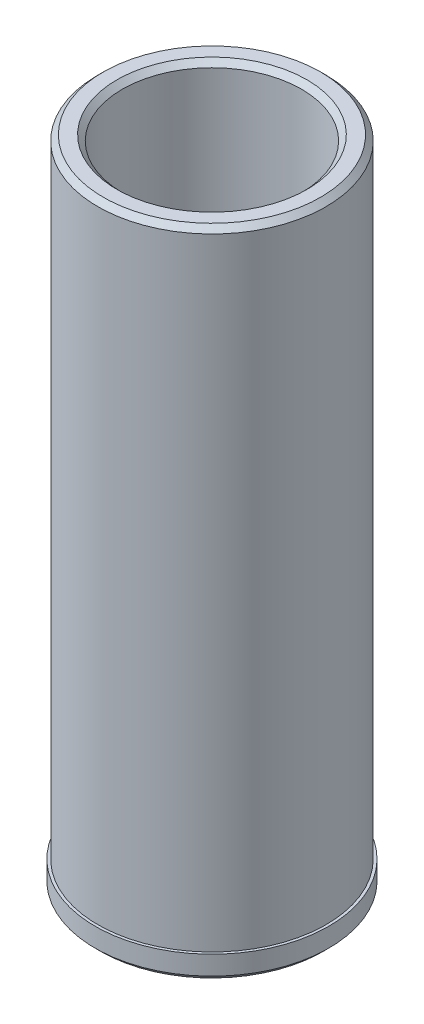
ISO-10303-21;
HEADER;
FILE_DESCRIPTION(('STEP AP214'),'2;1');
FILE_NAME('part.step','',(''),(''),'','','');
FILE_SCHEMA(('AUTOMOTIVE_DESIGN { 1 0 10303 214 1 1 1 1 }'));
ENDSEC;
DATA;
#1=APPLICATION_CONTEXT('core data for automotive mechanical design processes');
#2=APPLICATION_PROTOCOL_DEFINITION('international standard','automotive_design',2000,#1);
#3=PRODUCT_CONTEXT('',#1,'mechanical');
#4=PRODUCT('Part','Part','',(#3));
#5=PRODUCT_RELATED_PRODUCT_CATEGORY('part','',(#4));
#6=PRODUCT_DEFINITION_FORMATION('','',#4);
#7=PRODUCT_DEFINITION_CONTEXT('part definition',#1,'design');
#8=PRODUCT_DEFINITION('design','',#6,#7);
#9=PRODUCT_DEFINITION_SHAPE('','',#8);
#10=(LENGTH_UNIT() NAMED_UNIT(*) SI_UNIT(.MILLI.,.METRE.));
#11=(NAMED_UNIT(*) PLANE_ANGLE_UNIT() SI_UNIT($,.RADIAN.));
#12=(NAMED_UNIT(*) SI_UNIT($,.STERADIAN.) SOLID_ANGLE_UNIT());
#13=UNCERTAINTY_MEASURE_WITH_UNIT(LENGTH_MEASURE(1.E-05),#10,'distance_accuracy_value','');
#14=(GEOMETRIC_REPRESENTATION_CONTEXT(3) GLOBAL_UNCERTAINTY_ASSIGNED_CONTEXT((#13)) GLOBAL_UNIT_ASSIGNED_CONTEXT((#10,
#11,#12)) REPRESENTATION_CONTEXT('',''));
#15=CARTESIAN_POINT('',(0.,0.,0.));
#16=DIRECTION('',(0.,0.,1.));
#17=DIRECTION('',(1.,0.,0.));
#18=AXIS2_PLACEMENT_3D('',#15,#16,#17);
#19=CARTESIAN_POINT('',(0.,0.,0.));
#20=DIRECTION('',(0.,-1.,0.));
#21=DIRECTION('',(0.,0.,-1.));
#22=AXIS2_PLACEMENT_3D('',#19,#20,#21);
#23=PLANE('',#22);
#24=CARTESIAN_POINT('',(0.,0.,0.));
#25=DIRECTION('',(0.,-1.,0.));
#26=DIRECTION('',(0.,0.,-1.));
#27=AXIS2_PLACEMENT_3D('',#24,#25,#26);
#28=CIRCLE('',#27,6.99999999999999);
#29=CARTESIAN_POINT('',(0.,0.,-6.99999999999999));
#30=VERTEX_POINT('',#29);
#31=EDGE_CURVE('E72',#30,#30,#28,.T.);
#32=ORIENTED_EDGE('',*,*,#31,.F.);
#33=EDGE_LOOP('',(#32));
#34=FACE_BOUND('',#33,.T.);
#35=CARTESIAN_POINT('',(0.,0.,0.));
#36=DIRECTION('',(0.,-1.,0.));
#37=DIRECTION('',(0.,0.,-1.));
#38=AXIS2_PLACEMENT_3D('',#35,#36,#37);
#39=CIRCLE('',#38,20.5);
#40=CARTESIAN_POINT('',(0.,0.,-20.5));
#41=VERTEX_POINT('',#40);
#42=EDGE_CURVE('E66',#41,#41,#39,.T.);
#43=ORIENTED_EDGE('',*,*,#42,.T.);
#44=EDGE_LOOP('',(#43));
#45=FACE_BOUND('',#44,.T.);
#46=ADVANCED_FACE('F35',(#34,#45),#23,.T.);
#47=CARTESIAN_POINT('',(0.,13.,0.));
#48=DIRECTION('',(0.,1.,0.));
#49=DIRECTION('',(0.,0.,1.));
#50=AXIS2_PLACEMENT_3D('',#47,#48,#49);
#51=CONICAL_SURFACE('',#50,16.5,1.39626340159546);
#52=CARTESIAN_POINT('',(0.,11.3248936832695,0.));
#53=DIRECTION('',(0.,1.,0.));
#54=DIRECTION('',(0.,0.,1.));
#55=AXIS2_PLACEMENT_3D('',#52,#53,#54);
#56=CIRCLE('',#55,6.99999999999999);
#57=CARTESIAN_POINT('',(0.,11.3248936832695,6.99999999999999));
#58=VERTEX_POINT('',#57);
#59=EDGE_CURVE('E69',#58,#58,#56,.T.);
#60=ORIENTED_EDGE('',*,*,#59,.F.);
#61=EDGE_LOOP('',(#60));
#62=FACE_BOUND('',#61,.T.);
#63=CARTESIAN_POINT('',(0.,13.,0.));
#64=DIRECTION('',(0.,-1.,0.));
#65=DIRECTION('',(0.,0.,-1.));
#66=AXIS2_PLACEMENT_3D('',#63,#64,#65);
#67=CIRCLE('',#66,16.5);
#68=CARTESIAN_POINT('',(0.,13.,-16.5));
#69=VERTEX_POINT('',#68);
#70=EDGE_CURVE('E10',#69,#69,#67,.T.);
#71=ORIENTED_EDGE('',*,*,#70,.F.);
#72=EDGE_LOOP('',(#71));
#73=FACE_BOUND('',#72,.T.);
#74=ADVANCED_FACE('F80',(#62,#73),#51,.F.);
#75=CARTESIAN_POINT('',(0.,0.,0.));
#76=DIRECTION('',(0.,-1.,0.));
#77=DIRECTION('',(0.,0.,-1.));
#78=AXIS2_PLACEMENT_3D('',#75,#76,#77);
#79=CYLINDRICAL_SURFACE('',#78,16.5);
#80=ORIENTED_EDGE('',*,*,#70,.T.);
#81=EDGE_LOOP('',(#80));
#82=FACE_BOUND('',#81,.T.);
#83=CARTESIAN_POINT('',(0.,119.,0.));
#84=DIRECTION('',(0.,-1.,0.));
#85=DIRECTION('',(0.,0.,-1.));
#86=AXIS2_PLACEMENT_3D('',#83,#84,#85);
#87=CIRCLE('',#86,16.5);
#88=CARTESIAN_POINT('',(0.,119.,-16.5));
#89=VERTEX_POINT('',#88);
#90=EDGE_CURVE('E41',#89,#89,#87,.T.);
#91=ORIENTED_EDGE('',*,*,#90,.F.);
#92=EDGE_LOOP('',(#91));
#93=FACE_BOUND('',#92,.T.);
#94=ADVANCED_FACE('F116',(#82,#93),#79,.F.);
#95=CARTESIAN_POINT('',(0.,120.,0.));
#96=DIRECTION('',(0.,1.,0.));
#97=DIRECTION('',(0.,0.,1.));
#98=AXIS2_PLACEMENT_3D('',#95,#96,#97);
#99=CONICAL_SURFACE('',#98,17.5,0.785398163397448);
#100=ORIENTED_EDGE('',*,*,#90,.T.);
#101=EDGE_LOOP('',(#100));
#102=FACE_BOUND('',#101,.T.);
#103=CARTESIAN_POINT('',(0.,120.,0.));
#104=DIRECTION('',(0.,-1.,0.));
#105=DIRECTION('',(0.,0.,-1.));
#106=AXIS2_PLACEMENT_3D('',#103,#104,#105);
#107=CIRCLE('',#106,17.5);
#108=CARTESIAN_POINT('',(0.,120.,-17.5));
#109=VERTEX_POINT('',#108);
#110=EDGE_CURVE('E45',#109,#109,#107,.T.);
#111=ORIENTED_EDGE('',*,*,#110,.F.);
#112=EDGE_LOOP('',(#111));
#113=FACE_BOUND('',#112,.T.);
#114=ADVANCED_FACE('F112',(#102,#113),#99,.F.);
#115=CARTESIAN_POINT('',(0.,120.,0.));
#116=DIRECTION('',(0.,1.,0.));
#117=DIRECTION('',(0.,0.,1.));
#118=AXIS2_PLACEMENT_3D('',#115,#116,#117);
#119=PLANE('',#118);
#120=ORIENTED_EDGE('',*,*,#110,.T.);
#121=EDGE_LOOP('',(#120));
#122=FACE_BOUND('',#121,.T.);
#123=CARTESIAN_POINT('',(0.,120.,0.));
#124=DIRECTION('',(0.,-1.,0.));
#125=DIRECTION('',(0.,0.,-1.));
#126=AXIS2_PLACEMENT_3D('',#123,#124,#125);
#127=CIRCLE('',#126,20.);
#128=CARTESIAN_POINT('',(0.,120.,-20.));
#129=VERTEX_POINT('',#128);
#130=EDGE_CURVE('E49',#129,#129,#127,.T.);
#131=ORIENTED_EDGE('',*,*,#130,.F.);
#132=EDGE_LOOP('',(#131));
#133=FACE_BOUND('',#132,.T.);
#134=ADVANCED_FACE('F108',(#122,#133),#119,.T.);
#135=CARTESIAN_POINT('',(0.,119.,0.));
#136=DIRECTION('',(0.,-1.,0.));
#137=DIRECTION('',(0.,0.,-1.));
#138=AXIS2_PLACEMENT_3D('',#135,#136,#137);
#139=CONICAL_SURFACE('',#138,21.,0.785398163397448);
#140=ORIENTED_EDGE('',*,*,#130,.T.);
#141=EDGE_LOOP('',(#140));
#142=FACE_BOUND('',#141,.T.);
#143=CARTESIAN_POINT('',(0.,119.,0.));
#144=DIRECTION('',(0.,-1.,0.));
#145=DIRECTION('',(0.,0.,-1.));
#146=AXIS2_PLACEMENT_3D('',#143,#144,#145);
#147=CIRCLE('',#146,21.);
#148=CARTESIAN_POINT('',(0.,119.,-21.));
#149=VERTEX_POINT('',#148);
#150=EDGE_CURVE('E54',#149,#149,#147,.T.);
#151=ORIENTED_EDGE('',*,*,#150,.F.);
#152=EDGE_LOOP('',(#151));
#153=FACE_BOUND('',#152,.T.);
#154=ADVANCED_FACE('F104',(#142,#153),#139,.T.);
#155=CARTESIAN_POINT('',(0.,0.,0.));
#156=DIRECTION('',(0.,-1.,0.));
#157=DIRECTION('',(0.,0.,-1.));
#158=AXIS2_PLACEMENT_3D('',#155,#156,#157);
#159=CYLINDRICAL_SURFACE('',#158,21.);
#160=ORIENTED_EDGE('',*,*,#150,.T.);
#161=EDGE_LOOP('',(#160));
#162=FACE_BOUND('',#161,.T.);
#163=CARTESIAN_POINT('',(0.,4.5,0.));
#164=DIRECTION('',(0.,-1.,0.));
#165=DIRECTION('',(0.,0.,-1.));
#166=AXIS2_PLACEMENT_3D('',#163,#164,#165);
#167=CIRCLE('',#166,21.);
#168=CARTESIAN_POINT('',(0.,4.5,-21.));
#169=VERTEX_POINT('',#168);
#170=EDGE_CURVE('E57',#169,#169,#167,.T.);
#171=ORIENTED_EDGE('',*,*,#170,.F.);
#172=EDGE_LOOP('',(#171));
#173=FACE_BOUND('',#172,.T.);
#174=ADVANCED_FACE('F100',(#162,#173),#159,.T.);
#175=CARTESIAN_POINT('',(0.,4.5,0.));
#176=DIRECTION('',(0.,1.,0.));
#177=DIRECTION('',(0.,0.,1.));
#178=AXIS2_PLACEMENT_3D('',#175,#176,#177);
#179=PLANE('',#178);
#180=ORIENTED_EDGE('',*,*,#170,.T.);
#181=EDGE_LOOP('',(#180));
#182=FACE_BOUND('',#181,.T.);
#183=CARTESIAN_POINT('',(0.,4.5,0.));
#184=DIRECTION('',(0.,-1.,0.));
#185=DIRECTION('',(0.,0.,-1.));
#186=AXIS2_PLACEMENT_3D('',#183,#184,#185);
#187=CIRCLE('',#186,21.5);
#188=CARTESIAN_POINT('',(0.,4.5,-21.5));
#189=VERTEX_POINT('',#188);
#190=EDGE_CURVE('E60',#189,#189,#187,.T.);
#191=ORIENTED_EDGE('',*,*,#190,.F.);
#192=EDGE_LOOP('',(#191));
#193=FACE_BOUND('',#192,.T.);
#194=ADVANCED_FACE('F94',(#182,#193),#179,.T.);
#195=CARTESIAN_POINT('',(0.,0.,0.));
#196=DIRECTION('',(0.,-1.,0.));
#197=DIRECTION('',(0.,0.,-1.));
#198=AXIS2_PLACEMENT_3D('',#195,#196,#197);
#199=CYLINDRICAL_SURFACE('',#198,21.5);
#200=ORIENTED_EDGE('',*,*,#190,.T.);
#201=EDGE_LOOP('',(#200));
#202=FACE_BOUND('',#201,.T.);
#203=CARTESIAN_POINT('',(0.,0.999999999999997,0.));
#204=DIRECTION('',(0.,-1.,0.));
#205=DIRECTION('',(0.,0.,-1.));
#206=AXIS2_PLACEMENT_3D('',#203,#204,#205);
#207=CIRCLE('',#206,21.5);
#208=CARTESIAN_POINT('',(0.,0.999999999999997,-21.5));
#209=VERTEX_POINT('',#208);
#210=EDGE_CURVE('E63',#209,#209,#207,.T.);
#211=ORIENTED_EDGE('',*,*,#210,.F.);
#212=EDGE_LOOP('',(#211));
#213=FACE_BOUND('',#212,.T.);
#214=ADVANCED_FACE('F85',(#202,#213),#199,.T.);
#215=CARTESIAN_POINT('',(0.,0.,0.));
#216=DIRECTION('',(0.,1.,0.));
#217=DIRECTION('',(0.,0.,1.));
#218=AXIS2_PLACEMENT_3D('',#215,#216,#217);
#219=CONICAL_SURFACE('',#218,20.5,0.785398163397449);
#220=ORIENTED_EDGE('',*,*,#210,.T.);
#221=EDGE_LOOP('',(#220));
#222=FACE_BOUND('',#221,.T.);
#223=ORIENTED_EDGE('',*,*,#42,.F.);
#224=EDGE_LOOP('',(#223));
#225=FACE_BOUND('',#224,.T.);
#226=ADVANCED_FACE('F83',(#222,#225),#219,.T.);
#227=CARTESIAN_POINT('',(0.,0.,0.));
#228=DIRECTION('',(0.,-1.,0.));
#229=DIRECTION('',(0.,0.,-1.));
#230=AXIS2_PLACEMENT_3D('',#227,#228,#229);
#231=CYLINDRICAL_SURFACE('',#230,6.99999999999999);
#232=ORIENTED_EDGE('',*,*,#59,.T.);
#233=EDGE_LOOP('',(#232));
#234=FACE_BOUND('',#233,.T.);
#235=ORIENTED_EDGE('',*,*,#31,.T.);
#236=EDGE_LOOP('',(#235));
#237=FACE_BOUND('',#236,.T.);
#238=ADVANCED_FACE('F76',(#234,#237),#231,.F.);
#239=CLOSED_SHELL('',(#46,#74,#94,#114,#134,#154,#174,#194,#214,#226,#238));
#240=MANIFOLD_SOLID_BREP('B2',#239);
#241=ADVANCED_BREP_SHAPE_REPRESENTATION('',(#18,#240),#14);
#242=SHAPE_DEFINITION_REPRESENTATION(#9,#241);
ENDSEC;
END-ISO-10303-21;
